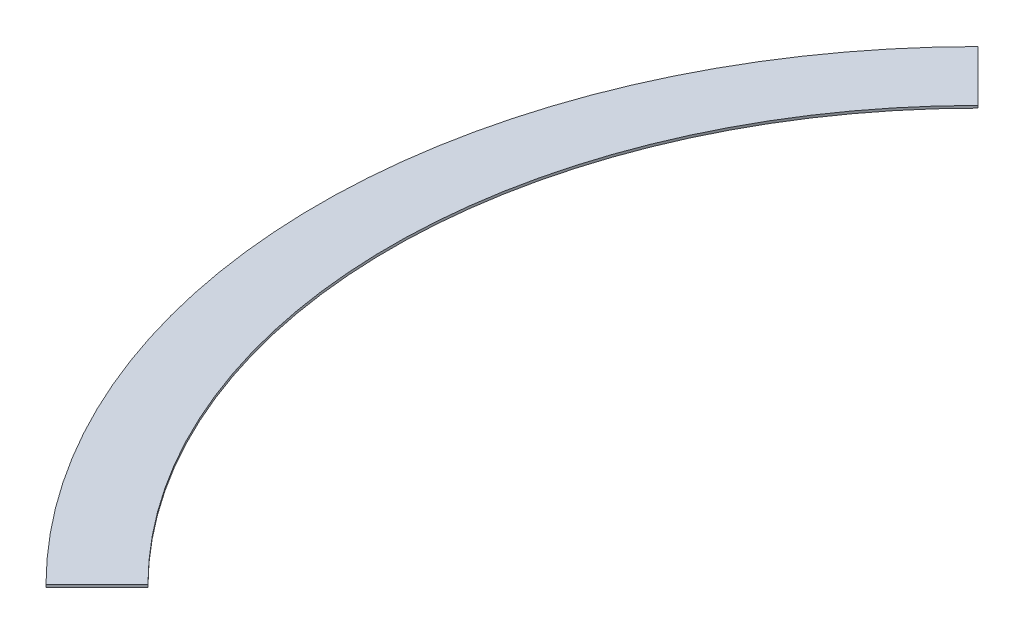
ISO-10303-21;
HEADER;
FILE_DESCRIPTION(('STEP AP214'),'2;1');
FILE_NAME('part.step','',(''),(''),'','','');
FILE_SCHEMA(('AUTOMOTIVE_DESIGN { 1 0 10303 214 1 1 1 1 }'));
ENDSEC;
DATA;
#1=APPLICATION_CONTEXT('core data for automotive mechanical design processes');
#2=APPLICATION_PROTOCOL_DEFINITION('international standard','automotive_design',2000,#1);
#3=PRODUCT_CONTEXT('',#1,'mechanical');
#4=PRODUCT('Part','Part','',(#3));
#5=PRODUCT_RELATED_PRODUCT_CATEGORY('part','',(#4));
#6=PRODUCT_DEFINITION_FORMATION('','',#4);
#7=PRODUCT_DEFINITION_CONTEXT('part definition',#1,'design');
#8=PRODUCT_DEFINITION('design','',#6,#7);
#9=PRODUCT_DEFINITION_SHAPE('','',#8);
#10=(LENGTH_UNIT() NAMED_UNIT(*) SI_UNIT(.MILLI.,.METRE.));
#11=(NAMED_UNIT(*) PLANE_ANGLE_UNIT() SI_UNIT($,.RADIAN.));
#12=(NAMED_UNIT(*) SI_UNIT($,.STERADIAN.) SOLID_ANGLE_UNIT());
#13=UNCERTAINTY_MEASURE_WITH_UNIT(LENGTH_MEASURE(1.E-05),#10,'distance_accuracy_value','');
#14=(GEOMETRIC_REPRESENTATION_CONTEXT(3) GLOBAL_UNCERTAINTY_ASSIGNED_CONTEXT((#13)) GLOBAL_UNIT_ASSIGNED_CONTEXT((#10,
#11,#12)) REPRESENTATION_CONTEXT('',''));
#15=CARTESIAN_POINT('',(0.,0.,0.));
#16=DIRECTION('',(0.,0.,1.));
#17=DIRECTION('',(1.,0.,0.));
#18=AXIS2_PLACEMENT_3D('',#15,#16,#17);
#19=CARTESIAN_POINT('',(-3.33066907387547E-13,-4.,1.11022302462516E-13));
#20=DIRECTION('',(0.,1.,0.));
#21=DIRECTION('',(0.,0.,1.));
#22=AXIS2_PLACEMENT_3D('',#19,#20,#21);
#23=CYLINDRICAL_SURFACE('',#22,1097.5);
#24=CARTESIAN_POINT('',(-3.33066907387547E-13,0.,1.11022302462516E-13));
#25=DIRECTION('',(0.,1.,0.));
#26=DIRECTION('',(0.,0.,-1.));
#27=AXIS2_PLACEMENT_3D('',#24,#25,#26);
#28=CIRCLE('',#27,1097.5);
#29=CARTESIAN_POINT('',(-776.049692352235,0.,-776.049692352237));
#30=VERTEX_POINT('',#29);
#31=CARTESIAN_POINT('',(-776.049692352234,0.,776.049692352238));
#32=VERTEX_POINT('',#31);
#33=EDGE_CURVE('E100',#30,#32,#28,.T.);
#34=ORIENTED_EDGE('',*,*,#33,.F.);
#35=DIRECTION('',(0.,1.,0.));
#36=VECTOR('',#35,1.);
#37=CARTESIAN_POINT('',(-776.049692352235,-4.,-776.049692352237));
#38=LINE('',#37,#36);
#39=CARTESIAN_POINT('',(-776.049692352235,-4.,-776.049692352237));
#40=VERTEX_POINT('',#39);
#41=EDGE_CURVE('E11',#40,#30,#38,.T.);
#42=ORIENTED_EDGE('',*,*,#41,.F.);
#43=CARTESIAN_POINT('',(-3.33066907387547E-13,-4.,1.11022302462516E-13));
#44=DIRECTION('',(0.,1.,0.));
#45=DIRECTION('',(0.,0.,-1.));
#46=AXIS2_PLACEMENT_3D('',#43,#44,#45);
#47=CIRCLE('',#46,1097.5);
#48=CARTESIAN_POINT('',(-776.049692352234,-4.,776.049692352238));
#49=VERTEX_POINT('',#48);
#50=EDGE_CURVE('E94',#40,#49,#47,.T.);
#51=ORIENTED_EDGE('',*,*,#50,.T.);
#52=DIRECTION('',(0.,1.,0.));
#53=VECTOR('',#52,1.);
#54=CARTESIAN_POINT('',(-776.049692352234,-4.,776.049692352238));
#55=LINE('',#54,#53);
#56=EDGE_CURVE('E39',#49,#32,#55,.T.);
#57=ORIENTED_EDGE('',*,*,#56,.T.);
#58=EDGE_LOOP('',(#34,#42,#51,#57));
#59=FACE_BOUND('',#58,.T.);
#60=ADVANCED_FACE('F36',(#59),#23,.T.);
#61=CARTESIAN_POINT('',(-776.049692352235,-4.,-776.049692352237));
#62=DIRECTION('',(0.707106781186549,0.,-0.707106781186546));
#63=DIRECTION('',(-0.707106781186546,0.,-0.707106781186549));
#64=AXIS2_PLACEMENT_3D('',#61,#62,#63);
#65=PLANE('',#64);
#66=DIRECTION('',(-0.707106781186546,0.,-0.707106781186549));
#67=VECTOR('',#66,1.);
#68=CARTESIAN_POINT('',(-776.049692352235,0.,-776.049692352237));
#69=LINE('',#68,#67);
#70=CARTESIAN_POINT('',(-691.196878609849,0.,-691.196878609851));
#71=VERTEX_POINT('',#70);
#72=EDGE_CURVE('E96',#71,#30,#69,.T.);
#73=ORIENTED_EDGE('',*,*,#72,.F.);
#74=DIRECTION('',(0.,1.,0.));
#75=VECTOR('',#74,1.);
#76=CARTESIAN_POINT('',(-691.196878609849,-4.,-691.196878609851));
#77=LINE('',#76,#75);
#78=CARTESIAN_POINT('',(-691.196878609849,-4.,-691.196878609851));
#79=VERTEX_POINT('',#78);
#80=EDGE_CURVE('E45',#79,#71,#77,.T.);
#81=ORIENTED_EDGE('',*,*,#80,.F.);
#82=DIRECTION('',(-0.707106781186546,0.,-0.707106781186549));
#83=VECTOR('',#82,1.);
#84=CARTESIAN_POINT('',(-776.049692352235,-4.,-776.049692352237));
#85=LINE('',#84,#83);
#86=EDGE_CURVE('E91',#79,#40,#85,.T.);
#87=ORIENTED_EDGE('',*,*,#86,.T.);
#88=ORIENTED_EDGE('',*,*,#41,.T.);
#89=EDGE_LOOP('',(#73,#81,#87,#88));
#90=FACE_BOUND('',#89,.T.);
#91=ADVANCED_FACE('F110',(#90),#65,.T.);
#92=CARTESIAN_POINT('',(6.66133814775094E-13,-4.,1.11022302462516E-13));
#93=DIRECTION('',(0.,1.,0.));
#94=DIRECTION('',(0.,0.,1.));
#95=AXIS2_PLACEMENT_3D('',#92,#93,#94);
#96=CYLINDRICAL_SURFACE('',#95,977.5);
#97=CARTESIAN_POINT('',(6.66133814775094E-13,0.,1.11022302462516E-13));
#98=DIRECTION('',(0.,-1.,0.));
#99=DIRECTION('',(0.,0.,-1.));
#100=AXIS2_PLACEMENT_3D('',#97,#98,#99);
#101=CIRCLE('',#100,977.5);
#102=CARTESIAN_POINT('',(-691.196878609849,0.,691.196878609852));
#103=VERTEX_POINT('',#102);
#104=EDGE_CURVE('E86',#103,#71,#101,.T.);
#105=ORIENTED_EDGE('',*,*,#104,.F.);
#106=DIRECTION('',(0.,1.,0.));
#107=VECTOR('',#106,1.);
#108=CARTESIAN_POINT('',(-691.196878609849,-4.,691.196878609852));
#109=LINE('',#108,#107);
#110=CARTESIAN_POINT('',(-691.196878609849,-4.,691.196878609852));
#111=VERTEX_POINT('',#110);
#112=EDGE_CURVE('E81',#111,#103,#109,.T.);
#113=ORIENTED_EDGE('',*,*,#112,.F.);
#114=CARTESIAN_POINT('',(6.66133814775094E-13,-4.,1.11022302462516E-13));
#115=DIRECTION('',(0.,-1.,0.));
#116=DIRECTION('',(0.,0.,-1.));
#117=AXIS2_PLACEMENT_3D('',#114,#115,#116);
#118=CIRCLE('',#117,977.5);
#119=EDGE_CURVE('E84',#111,#79,#118,.T.);
#120=ORIENTED_EDGE('',*,*,#119,.T.);
#121=ORIENTED_EDGE('',*,*,#80,.T.);
#122=EDGE_LOOP('',(#105,#113,#120,#121));
#123=FACE_BOUND('',#122,.T.);
#124=ADVANCED_FACE('F83',(#123),#96,.F.);
#125=CARTESIAN_POINT('',(-776.049692352234,-4.,776.049692352238));
#126=DIRECTION('',(0.707106781186549,0.,0.707106781186546));
#127=DIRECTION('',(0.707106781186546,0.,-0.707106781186549));
#128=AXIS2_PLACEMENT_3D('',#125,#126,#127);
#129=PLANE('',#128);
#130=DIRECTION('',(0.707106781186546,0.,-0.707106781186549));
#131=VECTOR('',#130,1.);
#132=CARTESIAN_POINT('',(-776.049692352234,0.,776.049692352238));
#133=LINE('',#132,#131);
#134=EDGE_CURVE('E103',#32,#103,#133,.T.);
#135=ORIENTED_EDGE('',*,*,#134,.F.);
#136=ORIENTED_EDGE('',*,*,#56,.F.);
#137=DIRECTION('',(0.707106781186546,0.,-0.707106781186549));
#138=VECTOR('',#137,1.);
#139=CARTESIAN_POINT('',(-776.049692352234,-4.,776.049692352238));
#140=LINE('',#139,#138);
#141=EDGE_CURVE('E90',#49,#111,#140,.T.);
#142=ORIENTED_EDGE('',*,*,#141,.T.);
#143=ORIENTED_EDGE('',*,*,#112,.T.);
#144=EDGE_LOOP('',(#135,#136,#142,#143));
#145=FACE_BOUND('',#144,.T.);
#146=ADVANCED_FACE('F93',(#145),#129,.T.);
#147=CARTESIAN_POINT('',(-3.33066907387547E-13,-4.,1.11022302462516E-13));
#148=DIRECTION('',(0.,-1.,0.));
#149=DIRECTION('',(0.,0.,-1.));
#150=AXIS2_PLACEMENT_3D('',#147,#148,#149);
#151=PLANE('',#150);
#152=ORIENTED_EDGE('',*,*,#50,.F.);
#153=ORIENTED_EDGE('',*,*,#86,.F.);
#154=ORIENTED_EDGE('',*,*,#119,.F.);
#155=ORIENTED_EDGE('',*,*,#141,.F.);
#156=EDGE_LOOP('',(#152,#153,#154,#155));
#157=FACE_BOUND('',#156,.T.);
#158=ADVANCED_FACE('F89',(#157),#151,.T.);
#159=CARTESIAN_POINT('',(-3.33066907387547E-13,0.,1.11022302462516E-13));
#160=DIRECTION('',(0.,-1.,0.));
#161=DIRECTION('',(0.,0.,-1.));
#162=AXIS2_PLACEMENT_3D('',#159,#160,#161);
#163=PLANE('',#162);
#164=ORIENTED_EDGE('',*,*,#33,.T.);
#165=ORIENTED_EDGE('',*,*,#134,.T.);
#166=ORIENTED_EDGE('',*,*,#104,.T.);
#167=ORIENTED_EDGE('',*,*,#72,.T.);
#168=EDGE_LOOP('',(#164,#165,#166,#167));
#169=FACE_BOUND('',#168,.T.);
#170=ADVANCED_FACE('F109',(#169),#163,.F.);
#171=CLOSED_SHELL('',(#60,#91,#124,#146,#158,#170));
#172=MANIFOLD_SOLID_BREP('B2',#171);
#173=ADVANCED_BREP_SHAPE_REPRESENTATION('',(#18,#172),#14);
#174=SHAPE_DEFINITION_REPRESENTATION(#9,#173);
ENDSEC;
END-ISO-10303-21;
